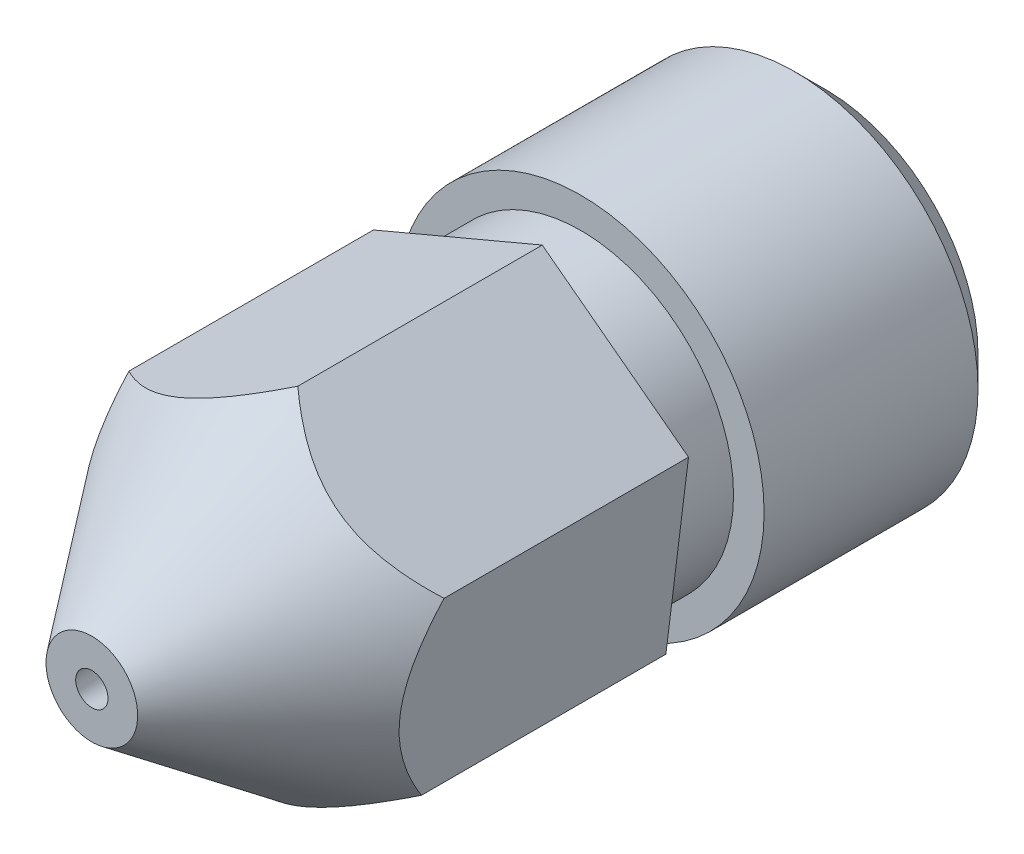
ISO-10303-21;
HEADER;
FILE_DESCRIPTION(('STEP AP214'),'2;1');
FILE_NAME('part.step','',(''),(''),'','','');
FILE_SCHEMA(('AUTOMOTIVE_DESIGN { 1 0 10303 214 1 1 1 1 }'));
ENDSEC;
DATA;
#1=APPLICATION_CONTEXT('core data for automotive mechanical design processes');
#2=APPLICATION_PROTOCOL_DEFINITION('international standard','automotive_design',2000,#1);
#3=PRODUCT_CONTEXT('',#1,'mechanical');
#4=PRODUCT('Part','Part','',(#3));
#5=PRODUCT_RELATED_PRODUCT_CATEGORY('part','',(#4));
#6=PRODUCT_DEFINITION_FORMATION('','',#4);
#7=PRODUCT_DEFINITION_CONTEXT('part definition',#1,'design');
#8=PRODUCT_DEFINITION('design','',#6,#7);
#9=PRODUCT_DEFINITION_SHAPE('','',#8);
#10=(LENGTH_UNIT() NAMED_UNIT(*) SI_UNIT(.MILLI.,.METRE.));
#11=(NAMED_UNIT(*) PLANE_ANGLE_UNIT() SI_UNIT($,.RADIAN.));
#12=(NAMED_UNIT(*) SI_UNIT($,.STERADIAN.) SOLID_ANGLE_UNIT());
#13=UNCERTAINTY_MEASURE_WITH_UNIT(LENGTH_MEASURE(1.E-05),#10,'distance_accuracy_value','');
#14=(GEOMETRIC_REPRESENTATION_CONTEXT(3) GLOBAL_UNCERTAINTY_ASSIGNED_CONTEXT((#13)) GLOBAL_UNIT_ASSIGNED_CONTEXT((#10,
#11,#12)) REPRESENTATION_CONTEXT('',''));
#15=CARTESIAN_POINT('',(0.,0.,0.));
#16=DIRECTION('',(0.,0.,1.));
#17=DIRECTION('',(1.,0.,0.));
#18=AXIS2_PLACEMENT_3D('',#15,#16,#17);
#19=CARTESIAN_POINT('',(0.,0.,-4.50000000000023));
#20=DIRECTION('',(0.,0.,1.));
#21=DIRECTION('',(1.,0.,0.));
#22=AXIS2_PLACEMENT_3D('',#19,#20,#21);
#23=CONICAL_SURFACE('',#22,2.99999999999296,0.785398163397448);
#24=CARTESIAN_POINT('',(0.,0.,-4.99999999999545));
#25=DIRECTION('',(0.,0.,1.));
#26=DIRECTION('',(1.,0.,0.));
#27=AXIS2_PLACEMENT_3D('',#24,#25,#26);
#28=CIRCLE('',#27,2.49999999999774);
#29=CARTESIAN_POINT('',(2.49999999999773,0.,-4.99999999999545));
#30=VERTEX_POINT('',#29);
#31=EDGE_CURVE('E183',#30,#30,#28,.T.);
#32=ORIENTED_EDGE('',*,*,#31,.T.);
#33=EDGE_LOOP('',(#32));
#34=FACE_BOUND('',#33,.T.);
#35=CARTESIAN_POINT('',(0.,0.,-4.50000000000023));
#36=DIRECTION('',(0.,0.,1.));
#37=DIRECTION('',(1.,0.,0.));
#38=AXIS2_PLACEMENT_3D('',#35,#36,#37);
#39=CIRCLE('',#38,2.99999999999296);
#40=CARTESIAN_POINT('',(2.99999999999295,0.,-4.50000000000023));
#41=VERTEX_POINT('',#40);
#42=EDGE_CURVE('E167',#41,#41,#39,.T.);
#43=ORIENTED_EDGE('',*,*,#42,.F.);
#44=EDGE_LOOP('',(#43));
#45=FACE_BOUND('',#44,.T.);
#46=ADVANCED_FACE('F39',(#34,#45),#23,.T.);
#47=CARTESIAN_POINT('',(2.49999999999773,0.,-4.99999999999545));
#48=DIRECTION('',(0.,0.,-1.));
#49=DIRECTION('',(-1.,0.,0.));
#50=AXIS2_PLACEMENT_3D('',#47,#48,#49);
#51=PLANE('',#50);
#52=CARTESIAN_POINT('',(0.,0.,-4.99999999999545));
#53=DIRECTION('',(0.,0.,1.));
#54=DIRECTION('',(1.,0.,0.));
#55=AXIS2_PLACEMENT_3D('',#52,#53,#54);
#56=CIRCLE('',#55,1.50000000002137);
#57=CARTESIAN_POINT('',(1.50000000002137,0.,-4.99999999999545));
#58=VERTEX_POINT('',#57);
#59=EDGE_CURVE('E163',#58,#58,#56,.T.);
#60=ORIENTED_EDGE('',*,*,#59,.T.);
#61=EDGE_LOOP('',(#60));
#62=FACE_BOUND('',#61,.T.);
#63=ORIENTED_EDGE('',*,*,#31,.F.);
#64=EDGE_LOOP('',(#63));
#65=FACE_BOUND('',#64,.T.);
#66=ADVANCED_FACE('F268',(#62,#65),#51,.T.);
#67=CARTESIAN_POINT('',(0.,0.,-4.99999999999545));
#68=DIRECTION('',(0.,0.,1.));
#69=DIRECTION('',(1.,0.,0.));
#70=AXIS2_PLACEMENT_3D('',#67,#68,#69);
#71=CYLINDRICAL_SURFACE('',#70,2.5);
#72=CARTESIAN_POINT('',(0.,0.,-1.));
#73=DIRECTION('',(0.,0.,1.));
#74=DIRECTION('',(1.,0.,0.));
#75=AXIS2_PLACEMENT_3D('',#72,#73,#74);
#76=CIRCLE('',#75,2.5);
#77=CARTESIAN_POINT('',(2.49999999999999,0.,-1.));
#78=VERTEX_POINT('',#77);
#79=EDGE_CURVE('E175',#78,#78,#76,.T.);
#80=ORIENTED_EDGE('',*,*,#79,.T.);
#81=EDGE_LOOP('',(#80));
#82=FACE_BOUND('',#81,.T.);
#83=CARTESIAN_POINT('',(0.,0.,0.));
#84=DIRECTION('',(0.,0.,1.));
#85=DIRECTION('',(1.,0.,0.));
#86=AXIS2_PLACEMENT_3D('',#83,#84,#85);
#87=CIRCLE('',#86,2.5);
#88=CARTESIAN_POINT('',(2.49999999999999,0.,0.));
#89=VERTEX_POINT('',#88);
#90=EDGE_CURVE('E179',#89,#89,#87,.T.);
#91=ORIENTED_EDGE('',*,*,#90,.F.);
#92=EDGE_LOOP('',(#91));
#93=FACE_BOUND('',#92,.T.);
#94=ADVANCED_FACE('F273',(#82,#93),#71,.T.);
#95=CARTESIAN_POINT('',(2.49999999999999,0.,-1.));
#96=DIRECTION('',(0.,0.,1.));
#97=DIRECTION('',(1.,0.,0.));
#98=AXIS2_PLACEMENT_3D('',#95,#96,#97);
#99=PLANE('',#98);
#100=CARTESIAN_POINT('',(0.,0.,-1.));
#101=DIRECTION('',(0.,0.,1.));
#102=DIRECTION('',(1.,0.,0.));
#103=AXIS2_PLACEMENT_3D('',#100,#101,#102);
#104=CIRCLE('',#103,2.99999999999296);
#105=CARTESIAN_POINT('',(2.99999999999295,0.,-1.));
#106=VERTEX_POINT('',#105);
#107=EDGE_CURVE('E171',#106,#106,#104,.T.);
#108=ORIENTED_EDGE('',*,*,#107,.T.);
#109=EDGE_LOOP('',(#108));
#110=FACE_BOUND('',#109,.T.);
#111=ORIENTED_EDGE('',*,*,#79,.F.);
#112=EDGE_LOOP('',(#111));
#113=FACE_BOUND('',#112,.T.);
#114=ADVANCED_FACE('F282',(#110,#113),#99,.T.);
#115=CARTESIAN_POINT('',(0.,0.,-4.99999999999545));
#116=DIRECTION('',(0.,0.,1.));
#117=DIRECTION('',(1.,0.,0.));
#118=AXIS2_PLACEMENT_3D('',#115,#116,#117);
#119=CYLINDRICAL_SURFACE('',#118,2.99999999999296);
#120=ORIENTED_EDGE('',*,*,#42,.T.);
#121=EDGE_LOOP('',(#120));
#122=FACE_BOUND('',#121,.T.);
#123=ORIENTED_EDGE('',*,*,#107,.F.);
#124=EDGE_LOOP('',(#123));
#125=FACE_BOUND('',#124,.T.);
#126=ADVANCED_FACE('F279',(#122,#125),#119,.T.);
#127=CARTESIAN_POINT('',(0.,0.,-4.49999999998704));
#128=DIRECTION('',(0.,0.,-1.));
#129=DIRECTION('',(-1.,0.,0.));
#130=AXIS2_PLACEMENT_3D('',#127,#128,#129);
#131=CONICAL_SURFACE('',#130,1.00000000001296,0.785398163397447);
#132=ORIENTED_EDGE('',*,*,#59,.F.);
#133=EDGE_LOOP('',(#132));
#134=FACE_BOUND('',#133,.T.);
#135=CARTESIAN_POINT('',(0.,0.,-4.49999999998704));
#136=DIRECTION('',(0.,0.,1.));
#137=DIRECTION('',(1.,0.,0.));
#138=AXIS2_PLACEMENT_3D('',#135,#136,#137);
#139=CIRCLE('',#138,1.00000000001296);
#140=CARTESIAN_POINT('',(1.00000000001296,0.,-4.49999999998704));
#141=VERTEX_POINT('',#140);
#142=EDGE_CURVE('E159',#141,#141,#139,.T.);
#143=ORIENTED_EDGE('',*,*,#142,.T.);
#144=EDGE_LOOP('',(#143));
#145=FACE_BOUND('',#144,.T.);
#146=ADVANCED_FACE('F265',(#134,#145),#131,.F.);
#147=CARTESIAN_POINT('',(0.,0.,-4.99999999999545));
#148=DIRECTION('',(0.,0.,1.));
#149=DIRECTION('',(1.,0.,0.));
#150=AXIS2_PLACEMENT_3D('',#147,#148,#149);
#151=CYLINDRICAL_SURFACE('',#150,1.00000000001296);
#152=CARTESIAN_POINT('',(0.,0.,0.));
#153=DIRECTION('',(0.,0.,1.));
#154=DIRECTION('',(1.,0.,0.));
#155=AXIS2_PLACEMENT_3D('',#152,#153,#154);
#156=CIRCLE('',#155,1.00000000001296);
#157=CARTESIAN_POINT('',(1.00000000001296,0.,0.));
#158=VERTEX_POINT('',#157);
#159=EDGE_CURVE('E109',#158,#158,#156,.T.);
#160=ORIENTED_EDGE('',*,*,#159,.T.);
#161=EDGE_LOOP('',(#160));
#162=FACE_BOUND('',#161,.T.);
#163=ORIENTED_EDGE('',*,*,#142,.F.);
#164=EDGE_LOOP('',(#163));
#165=FACE_BOUND('',#164,.T.);
#166=ADVANCED_FACE('F258',(#162,#165),#151,.F.);
#167=CARTESIAN_POINT('',(0.,0.,0.));
#168=DIRECTION('',(0.,0.,-1.));
#169=DIRECTION('',(-1.,0.,0.));
#170=AXIS2_PLACEMENT_3D('',#167,#168,#169);
#171=PLANE('',#170);
#172=DIRECTION('',(0.123460923134291,0.99234943465436,0.));
#173=VECTOR('',#172,1.);
#174=CARTESIAN_POINT('',(2.39300807481834,-1.80928503940421,0.));
#175=LINE('',#174,#173);
#176=CARTESIAN_POINT('',(2.39300807481834,-1.80928503940421,0.));
#177=VERTEX_POINT('',#176);
#178=CARTESIAN_POINT('',(2.76339084422034,1.16776326455187,0.));
#179=VERTEX_POINT('',#178);
#180=EDGE_CURVE('E113',#177,#179,#175,.T.);
#181=ORIENTED_EDGE('',*,*,#180,.F.);
#182=DIRECTION('',(0.921130281408947,0.389254421518206,0.));
#183=VECTOR('',#182,1.);
#184=CARTESIAN_POINT('',(-0.370382769402001,-2.97704830395608,0.));
#185=LINE('',#184,#183);
#186=CARTESIAN_POINT('',(-0.370382769402004,-2.97704830395608,0.));
#187=VERTEX_POINT('',#186);
#188=EDGE_CURVE('E135',#187,#177,#185,.T.);
#189=ORIENTED_EDGE('',*,*,#188,.F.);
#190=DIRECTION('',(0.797669358274657,-0.603095013136154,0.));
#191=VECTOR('',#190,1.);
#192=CARTESIAN_POINT('',(-2.76339084422034,-1.16776326455187,0.));
#193=LINE('',#192,#191);
#194=CARTESIAN_POINT('',(-2.76339084422034,-1.16776326455187,0.));
#195=VERTEX_POINT('',#194);
#196=EDGE_CURVE('E60',#195,#187,#193,.T.);
#197=ORIENTED_EDGE('',*,*,#196,.F.);
#198=DIRECTION('',(-0.123460923134291,-0.992349434654361,0.));
#199=VECTOR('',#198,1.);
#200=CARTESIAN_POINT('',(-2.39300807481834,1.80928503940421,0.));
#201=LINE('',#200,#199);
#202=CARTESIAN_POINT('',(-2.39300807481834,1.80928503940421,0.));
#203=VERTEX_POINT('',#202);
#204=EDGE_CURVE('E127',#203,#195,#201,.T.);
#205=ORIENTED_EDGE('',*,*,#204,.F.);
#206=DIRECTION('',(-0.921130281408947,-0.389254421518206,0.));
#207=VECTOR('',#206,1.);
#208=CARTESIAN_POINT('',(0.370382769402002,2.97704830395608,0.));
#209=LINE('',#208,#207);
#210=CARTESIAN_POINT('',(0.370382769402002,2.97704830395608,0.));
#211=VERTEX_POINT('',#210);
#212=EDGE_CURVE('E123',#211,#203,#209,.T.);
#213=ORIENTED_EDGE('',*,*,#212,.F.);
#214=DIRECTION('',(-0.797669358274656,0.603095013136154,0.));
#215=VECTOR('',#214,1.);
#216=CARTESIAN_POINT('',(2.76339084422034,1.16776326455187,0.));
#217=LINE('',#216,#215);
#218=EDGE_CURVE('E104',#179,#211,#217,.T.);
#219=ORIENTED_EDGE('',*,*,#218,.F.);
#220=EDGE_LOOP('',(#181,#189,#197,#205,#213,#219));
#221=FACE_BOUND('',#220,.T.);
#222=ORIENTED_EDGE('',*,*,#90,.T.);
#223=EDGE_LOOP('',(#222));
#224=FACE_BOUND('',#223,.T.);
#225=ADVANCED_FACE('F119',(#221,#224),#171,.T.);
#226=CARTESIAN_POINT('',(0.,0.,8.));
#227=DIRECTION('',(0.,0.,-1.));
#228=DIRECTION('',(-1.,0.,0.));
#229=AXIS2_PLACEMENT_3D('',#226,#227,#228);
#230=CONICAL_SURFACE('',#229,0.,0.643501108792156);
#231=CARTESIAN_POINT('',(0.,0.,7.));
#232=DIRECTION('',(0.,0.,-1.));
#233=DIRECTION('',(-1.,0.,0.));
#234=AXIS2_PLACEMENT_3D('',#231,#232,#233);
#235=CIRCLE('',#234,0.749999999998237);
#236=CARTESIAN_POINT('',(-0.749999999998236,0.,7.));
#237=VERTEX_POINT('',#236);
#238=EDGE_CURVE('E158',#237,#237,#235,.T.);
#239=ORIENTED_EDGE('',*,*,#238,.T.);
#240=EDGE_LOOP('',(#239));
#241=FACE_BOUND('',#240,.T.);
#242=CARTESIAN_POINT('',(-0.370582769402001,-2.9771328206481,3.99985524244155));
#243=CARTESIAN_POINT('',(-0.333361920773163,-2.96140390564677,4.02679221943423));
#244=CARTESIAN_POINT('',(-0.295793541917818,-2.94552813011983,4.05317321176297));
#245=CARTESIAN_POINT('',(-0.219932807668971,-2.91347063855543,4.10462298886514));
#246=CARTESIAN_POINT('',(-0.181640877185633,-2.89728910207797,4.1296925130885));
#247=CARTESIAN_POINT('',(-0.104006471428016,-2.86448208627032,4.17851080751373));
#248=CARTESIAN_POINT('',(-0.064658730825574,-2.84785438189953,4.2022497695316));
#249=CARTESIAN_POINT('',(0.0149159389363024,-2.81422744261545,4.24801646835328));
#250=CARTESIAN_POINT('',(0.0551436438455453,-2.79722787988313,4.27004261030164));
#251=CARTESIAN_POINT('',(0.178035775469737,-2.74529569768265,4.33360293794611));
#252=CARTESIAN_POINT('',(0.262078530884565,-2.70978061930334,4.37208454741731));
#253=CARTESIAN_POINT('',(0.433623631067221,-2.63728849730541,4.43839845315821));
#254=CARTESIAN_POINT('',(0.521120752794357,-2.6003136608574,4.46624619518939));
#255=CARTESIAN_POINT('',(0.662678510240097,-2.54049369391236,4.50014531979392));
#256=CARTESIAN_POINT('',(0.71588337198582,-2.51801019934186,4.51045553230541));
#257=CARTESIAN_POINT('',(0.82293558616725,-2.47277170426199,4.52603733132246));
#258=CARTESIAN_POINT('',(0.876783028073414,-2.45001666594389,4.53130820768266));
#259=CARTESIAN_POINT('',(0.984269806538549,-2.40459453118538,4.53654224280696));
#260=CARTESIAN_POINT('',(1.03790738375276,-2.38192817821496,4.53654734923023));
#261=CARTESIAN_POINT('',(1.14495601601545,-2.33669119679471,4.53136796460535));
#262=CARTESIAN_POINT('',(1.1983670787631,-2.31412056509134,4.52618365138728));
#263=CARTESIAN_POINT('',(1.35720846685355,-2.24699682170541,4.50319933837946));
#264=CARTESIAN_POINT('',(1.46177394947424,-2.20280917825281,4.47799026676357));
#265=CARTESIAN_POINT('',(1.66695882120838,-2.11610144519578,4.41120973182767));
#266=CARTESIAN_POINT('',(1.76754392865753,-2.07359584245566,4.3695204503603));
#267=CARTESIAN_POINT('',(1.95840191705215,-1.99294241333265,4.27664427152543));
#268=CARTESIAN_POINT('',(2.04893869757002,-1.95468306735533,4.22608171985809));
#269=CARTESIAN_POINT('',(2.18098909567025,-1.89888075321891,4.14469972163282));
#270=CARTESIAN_POINT('',(2.22410122228619,-1.88066228158139,4.11685566698191));
#271=CARTESIAN_POINT('',(2.30935459191982,-1.84463561765665,4.05952584104556));
#272=CARTESIAN_POINT('',(2.35149640937574,-1.82682718262134,4.03004107835905));
#273=CARTESIAN_POINT('',(2.39320807481834,-1.80920052271219,3.99985524244155));
#274=B_SPLINE_CURVE_WITH_KNOTS('',3,(#242,#243,#244,#245,#246,#247,#248,#249,#250,#251,#252,
#253,#254,#255,#256,#257,#258,#259,#260,#261,#262,#263,#264,#265,#266,#267,#268,#269,#270,#271,
#272,#273),.UNSPECIFIED.,.F.,.F.,(4,2,2,2,2,2,2,2,2,2,2,2,2,2,2,4),(0.,0.145693025165176,
0.291302998167504,0.43787392461132,0.584579732690164,0.881125926877011,1.17723973235047,
1.35306592789389,1.52891689728815,1.70336700905731,1.87781114300715,2.22500602088697,
2.57472925837995,2.9058200715097,3.06917296361676,3.23242652329506),.UNSPECIFIED.);
#275=CARTESIAN_POINT('',(-0.370382769402001,-2.97704830395608,4.));
#276=VERTEX_POINT('',#275);
#277=CARTESIAN_POINT('',(2.39300807481835,-1.8092850394042,4.));
#278=VERTEX_POINT('',#277);
#279=EDGE_CURVE('E187',#276,#278,#274,.T.);
#280=ORIENTED_EDGE('',*,*,#279,.T.);
#281=CARTESIAN_POINT('',(2.39298319226814,-1.80948503940421,3.99986563195734));
#282=CARTESIAN_POINT('',(2.39797192228569,-1.76938681814616,4.0268021058926));
#283=CARTESIAN_POINT('',(2.4030072316939,-1.72891420286275,4.05318260000207));
#284=CARTESIAN_POINT('',(2.41317488477654,-1.64718903402254,4.10463139540376));
#285=CARTESIAN_POINT('',(2.41830717150243,-1.60593693820446,4.12970043611267));
#286=CARTESIAN_POINT('',(2.42871254787059,-1.5223010063309,4.17851777332693));
#287=CARTESIAN_POINT('',(2.43398634319775,-1.47991149814862,4.20225626208727));
#288=CARTESIAN_POINT('',(2.44465177042376,-1.39418533954404,4.24802203883542));
#289=CARTESIAN_POINT('',(2.45004350629254,-1.35084785343625,4.27004773203637));
#290=CARTESIAN_POINT('',(2.46651478295772,-1.21845566267845,4.33360673818322));
#291=CARTESIAN_POINT('',(2.47777905903127,-1.12791609996015,4.37208752832603));
#292=CARTESIAN_POINT('',(2.50077129275697,-0.943110012658147,4.43840003092347));
#293=CARTESIAN_POINT('',(2.51249855040215,-0.848849114563483,4.46624718823034));
#294=CARTESIAN_POINT('',(2.53147165119599,-0.69634785855129,4.50014581538181));
#295=CARTESIAN_POINT('',(2.53860279847443,-0.639029398664991,4.51045594493281));
#296=CARTESIAN_POINT('',(2.55295120638524,-0.523700320305522,4.52603758394495));
#297=CARTESIAN_POINT('',(2.56016847900888,-0.465689605449444,4.53130838329195));
#298=CARTESIAN_POINT('',(2.57457513189871,-0.349892367849549,4.53654227538365));
#299=CARTESIAN_POINT('',(2.58176427636791,-0.292107740385642,4.53654731484393));
#300=CARTESIAN_POINT('',(2.59611220345845,-0.17678252674483,4.53136780733093));
#301=CARTESIAN_POINT('',(2.60327098711168,-0.119241932273704,4.52618343817866));
#302=CARTESIAN_POINT('',(2.6245607913658,0.05188043324189,4.50319897810853));
#303=CARTESIAN_POINT('',(2.63857589473794,0.164530489266799,4.47798983549132));
#304=CARTESIAN_POINT('',(2.66607719667653,0.385579390718213,4.41120921597008));
#305=CARTESIAN_POINT('',(2.6795588005271,0.493941304915133,4.36951992434762));
#306=CARTESIAN_POINT('',(2.70513947518682,0.69955266268084,4.27664509848014));
#307=CARTESIAN_POINT('',(2.71727393494992,0.797086554215518,4.22608422605656));
#308=CARTESIAN_POINT('',(2.73497239514727,0.939342553322076,4.1447050278909));
#309=CARTESIAN_POINT('',(2.74075063421682,0.985786659913881,4.1168619384444));
#310=CARTESIAN_POINT('',(2.7521769902271,1.07762898248122,4.05953411890449));
#311=CARTESIAN_POINT('',(2.75782518414813,1.12302781720608,4.0300503972492));
#312=CARTESIAN_POINT('',(2.76341572677055,1.16796326455187,3.99986563195734));
#313=B_SPLINE_CURVE_WITH_KNOTS('',3,(#281,#282,#283,#284,#285,#286,#287,#288,#289,#290,#291,
#292,#293,#294,#295,#296,#297,#298,#299,#300,#301,#302,#303,#304,#305,#306,#307,#308,#309,#310,
#311,#312),.UNSPECIFIED.,.F.,.F.,(4,2,2,2,2,2,2,2,2,2,2,2,2,2,2,4),(0.,0.145691089404386,
0.291299130593188,0.437868081342506,0.584571908090664,0.881113991618833,1.17722370840094,
1.3530497134868,1.52890049133734,1.70335044206921,1.87779441527906,2.22498896391071,
2.57471180448658,2.90579247599771,3.06914044350928,3.23238909272478),.UNSPECIFIED.);
#314=CARTESIAN_POINT('',(2.76339084422034,1.16776326455187,4.));
#315=VERTEX_POINT('',#314);
#316=EDGE_CURVE('E12',#278,#315,#313,.T.);
#317=ORIENTED_EDGE('',*,*,#316,.T.);
#318=CARTESIAN_POINT('',(2.76359084422034,1.16761205026568,3.9998328358871));
#319=CARTESIAN_POINT('',(2.73135802287283,1.19198236562547,4.02677089781496));
#320=CARTESIAN_POINT('',(2.69882424064471,1.21658022890892,4.05315296464437));
#321=CARTESIAN_POINT('',(2.63312971129852,1.26624998571732,4.10460485896189));
#322=CARTESIAN_POINT('',(2.59996933218114,1.29132160100746,4.12967542597169));
#323=CARTESIAN_POINT('',(2.53273878433325,1.34215269752241,4.17849578479594));
#324=CARTESIAN_POINT('',(2.49866405547437,1.36791562652999,4.20223576747961));
#325=CARTESIAN_POINT('',(2.42975320931284,1.42001714859536,4.24800445491925));
#326=CARTESIAN_POINT('',(2.39491642016097,1.44635624961913,4.2700315646718));
#327=CARTESIAN_POINT('',(2.28849297723285,1.52681997440049,4.33359474236047));
#328=CARTESIAN_POINT('',(2.21571266718473,1.5818470875636,4.37207811885524));
#329=CARTESIAN_POINT('',(2.0671559574409,1.69416657167692,4.43839505070079));
#330=CARTESIAN_POINT('',(1.99138408139398,1.75145552242553,4.46624405377415));
#331=CARTESIAN_POINT('',(1.86879726600073,1.84413991135558,4.50014425116406));
#332=CARTESIAN_POINT('',(1.82272347223468,1.8789749905376,4.5104546425654));
#333=CARTESIAN_POINT('',(1.73001949507152,1.94906581920616,4.52603678660069));
#334=CARTESIAN_POINT('',(1.68338923418692,1.98432162727877,4.53130782902195));
#335=CARTESIAN_POINT('',(1.59030893079006,2.05469698546136,4.53654217255738));
#336=CARTESIAN_POINT('',(1.54386041197414,2.08981538354805,4.53654742336562));
#337=CARTESIAN_POINT('',(1.45115952649325,2.15990387468397,4.5313683037058));
#338=CARTESIAN_POINT('',(1.40490715316066,2.1948739727744,4.52618411108735));
#339=CARTESIAN_POINT('',(1.26735527414931,2.29887301876845,4.50320011515134));
#340=CARTESIAN_POINT('',(1.17680468570075,2.36733573175017,4.47799119660345));
#341=CARTESIAN_POINT('',(0.999120671037324,2.50167753897379,4.41121084398575));
#342=CARTESIAN_POINT('',(0.912016933371524,2.56753418655192,4.36952158437386));
#343=CARTESIAN_POINT('',(0.746734433138288,2.69249956301435,4.27664248769128));
#344=CARTESIAN_POINT('',(0.668327392372469,2.75178088652277,4.22607631454379));
#345=CARTESIAN_POINT('',(0.553968765064754,2.83824417751286,4.14468827767456));
#346=CARTESIAN_POINT('',(0.516632743748496,2.86647287657544,4.11684214145396));
#347=CARTESIAN_POINT('',(0.442801557394463,2.92229452729091,4.05950798850506));
#348=CARTESIAN_POINT('',(0.406305894733334,2.9498878551826,4.03002098072255));
#349=CARTESIAN_POINT('',(0.370182769402002,2.97719951824227,3.9998328358871));
#350=B_SPLINE_CURVE_WITH_KNOTS('',3,(#318,#319,#320,#321,#322,#323,#324,#325,#326,#327,#328,
#329,#330,#331,#332,#333,#334,#335,#336,#337,#338,#339,#340,#341,#342,#343,#344,#345,#346,#347,
#348,#349),.UNSPECIFIED.,.F.,.F.,(4,2,2,2,2,2,2,2,2,2,2,2,2,2,2,4),(0.,0.145697200001847,
0.291311339327328,0.43788652673678,0.584596607937403,0.881151667549265,1.17727429106834,
1.35310089737553,1.5289522798762,1.70340273896161,1.87784721958652,2.22504280756198,
2.57476690108368,2.90587958542842,3.06924309780157,3.23250724726373),.UNSPECIFIED.);
#351=CARTESIAN_POINT('',(0.370382769402002,2.97704830395608,4.));
#352=VERTEX_POINT('',#351);
#353=EDGE_CURVE('E53',#315,#352,#350,.T.);
#354=ORIENTED_EDGE('',*,*,#353,.T.);
#355=CARTESIAN_POINT('',(0.370582769402002,2.9771328206481,3.99985524244155));
#356=CARTESIAN_POINT('',(0.333361920773164,2.96140390564677,4.02679221943423));
#357=CARTESIAN_POINT('',(0.295793541917819,2.94552813011983,4.05317321176297));
#358=CARTESIAN_POINT('',(0.219932807668972,2.91347063855543,4.10462298886514));
#359=CARTESIAN_POINT('',(0.181640877185634,2.89728910207797,4.1296925130885));
#360=CARTESIAN_POINT('',(0.104006471428017,2.86448208627032,4.17851080751374));
#361=CARTESIAN_POINT('',(0.0646587308255749,2.84785438189953,4.2022497695316));
#362=CARTESIAN_POINT('',(-0.0149159389363014,2.81422744261545,4.24801646835328));
#363=CARTESIAN_POINT('',(-0.0551436438455442,2.79722787988313,4.27004261030164));
#364=CARTESIAN_POINT('',(-0.178035775469735,2.74529569768265,4.33360293794611));
#365=CARTESIAN_POINT('',(-0.262078530884563,2.70978061930334,4.37208454741731));
#366=CARTESIAN_POINT('',(-0.433623631067219,2.63728849730541,4.43839845315821));
#367=CARTESIAN_POINT('',(-0.521120752794356,2.6003136608574,4.46624619518939));
#368=CARTESIAN_POINT('',(-0.662678510240095,2.54049369391236,4.50014531979392));
#369=CARTESIAN_POINT('',(-0.715883371985818,2.51801019934186,4.51045553230541));
#370=CARTESIAN_POINT('',(-0.822935586167248,2.47277170426199,4.52603733132246));
#371=CARTESIAN_POINT('',(-0.876783028073412,2.45001666594389,4.53130820768266));
#372=CARTESIAN_POINT('',(-0.984269806538547,2.40459453118538,4.53654224280696));
#373=CARTESIAN_POINT('',(-1.03790738375276,2.38192817821496,4.53654734923023));
#374=CARTESIAN_POINT('',(-1.14495601601545,2.33669119679471,4.53136796460535));
#375=CARTESIAN_POINT('',(-1.19836707876309,2.31412056509134,4.52618365138728));
#376=CARTESIAN_POINT('',(-1.35720846685355,2.24699682170541,4.50319933837946));
#377=CARTESIAN_POINT('',(-1.46177394947424,2.20280917825282,4.47799026676357));
#378=CARTESIAN_POINT('',(-1.66695882120838,2.11610144519578,4.41120973182767));
#379=CARTESIAN_POINT('',(-1.76754392865753,2.07359584245566,4.3695204503603));
#380=CARTESIAN_POINT('',(-1.95840191705214,1.99294241333265,4.27664427152543));
#381=CARTESIAN_POINT('',(-2.04893869757002,1.95468306735533,4.22608171985809));
#382=CARTESIAN_POINT('',(-2.18098909567025,1.89888075321891,4.14469972163282));
#383=CARTESIAN_POINT('',(-2.22410122228618,1.88066228158139,4.11685566698191));
#384=CARTESIAN_POINT('',(-2.30935459191982,1.84463561765665,4.05952584104556));
#385=CARTESIAN_POINT('',(-2.35149640937574,1.82682718262135,4.03004107835905));
#386=CARTESIAN_POINT('',(-2.39320807481834,1.80920052271219,3.99985524244155));
#387=B_SPLINE_CURVE_WITH_KNOTS('',3,(#355,#356,#357,#358,#359,#360,#361,#362,#363,#364,#365,
#366,#367,#368,#369,#370,#371,#372,#373,#374,#375,#376,#377,#378,#379,#380,#381,#382,#383,#384,
#385,#386),.UNSPECIFIED.,.F.,.F.,(4,2,2,2,2,2,2,2,2,2,2,2,2,2,2,4),(0.,0.145693025165176,
0.291302998167504,0.43787392461132,0.584579732690164,0.88112592687701,1.17723973235046,
1.35306592789389,1.52891689728815,1.7033670090573,1.87781114300715,2.22500602088696,
2.57472925837995,2.9058200715097,3.06917296361676,3.23242652329506),.UNSPECIFIED.);
#388=CARTESIAN_POINT('',(-2.39300807481834,1.80928503940421,4.));
#389=VERTEX_POINT('',#388);
#390=EDGE_CURVE('E233',#352,#389,#387,.T.);
#391=ORIENTED_EDGE('',*,*,#390,.T.);
#392=CARTESIAN_POINT('',(-2.39298319226814,1.80948503940421,3.99986563195734));
#393=CARTESIAN_POINT('',(-2.39797192228569,1.76938681814616,4.0268021058926));
#394=CARTESIAN_POINT('',(-2.4030072316939,1.72891420286275,4.05318260000207));
#395=CARTESIAN_POINT('',(-2.41317488477654,1.64718903402254,4.10463139540376));
#396=CARTESIAN_POINT('',(-2.41830717150243,1.60593693820446,4.12970043611267));
#397=CARTESIAN_POINT('',(-2.42871254787059,1.5223010063309,4.17851777332693));
#398=CARTESIAN_POINT('',(-2.43398634319775,1.47991149814862,4.20225626208726));
#399=CARTESIAN_POINT('',(-2.44465177042376,1.39418533954404,4.24802203883542));
#400=CARTESIAN_POINT('',(-2.45004350629254,1.35084785343625,4.27004773203637));
#401=CARTESIAN_POINT('',(-2.46651478295772,1.21845566267845,4.33360673818322));
#402=CARTESIAN_POINT('',(-2.47777905903127,1.12791609996015,4.37208752832603));
#403=CARTESIAN_POINT('',(-2.50077129275697,0.943110012658147,4.43840003092347));
#404=CARTESIAN_POINT('',(-2.51249855040215,0.848849114563484,4.46624718823034));
#405=CARTESIAN_POINT('',(-2.53147165119599,0.696347858551291,4.50014581538181));
#406=CARTESIAN_POINT('',(-2.53860279847443,0.639029398664992,4.51045594493281));
#407=CARTESIAN_POINT('',(-2.55295120638524,0.523700320305524,4.52603758394495));
#408=CARTESIAN_POINT('',(-2.56016847900888,0.465689605449445,4.53130838329195));
#409=CARTESIAN_POINT('',(-2.57457513189871,0.34989236784955,4.53654227538365));
#410=CARTESIAN_POINT('',(-2.58176427636791,0.292107740385643,4.53654731484393));
#411=CARTESIAN_POINT('',(-2.59611220345845,0.176782526744832,4.53136780733093));
#412=CARTESIAN_POINT('',(-2.60327098711168,0.119241932273705,4.52618343817866));
#413=CARTESIAN_POINT('',(-2.6245607913658,-0.0518804332418892,4.50319897810853));
#414=CARTESIAN_POINT('',(-2.63857589473794,-0.164530489266798,4.47798983549132));
#415=CARTESIAN_POINT('',(-2.66607719667653,-0.385579390718212,4.41120921597008));
#416=CARTESIAN_POINT('',(-2.6795588005271,-0.493941304915132,4.36951992434762));
#417=CARTESIAN_POINT('',(-2.70513947518682,-0.69955266268084,4.27664509848014));
#418=CARTESIAN_POINT('',(-2.71727393494992,-0.797086554215519,4.22608422605657));
#419=CARTESIAN_POINT('',(-2.73497239514727,-0.939342553322077,4.1447050278909));
#420=CARTESIAN_POINT('',(-2.74075063421682,-0.985786659913881,4.1168619384444));
#421=CARTESIAN_POINT('',(-2.7521769902271,-1.07762898248122,4.05953411890449));
#422=CARTESIAN_POINT('',(-2.75782518414813,-1.12302781720608,4.0300503972492));
#423=CARTESIAN_POINT('',(-2.76341572677055,-1.16796326455187,3.99986563195734));
#424=B_SPLINE_CURVE_WITH_KNOTS('',3,(#392,#393,#394,#395,#396,#397,#398,#399,#400,#401,#402,
#403,#404,#405,#406,#407,#408,#409,#410,#411,#412,#413,#414,#415,#416,#417,#418,#419,#420,#421,
#422,#423),.UNSPECIFIED.,.F.,.F.,(4,2,2,2,2,2,2,2,2,2,2,2,2,2,2,4),(0.,0.145691089404386,
0.291299130593189,0.437868081342506,0.584571908090665,0.881113991618834,1.17722370840094,
1.3530497134868,1.52890049133734,1.70335044206921,1.87779441527906,2.22498896391071,
2.57471180448658,2.90579247599771,3.06914044350928,3.23238909272478),.UNSPECIFIED.);
#425=CARTESIAN_POINT('',(-2.76339084422034,-1.16776326455187,4.));
#426=VERTEX_POINT('',#425);
#427=EDGE_CURVE('E225',#389,#426,#424,.T.);
#428=ORIENTED_EDGE('',*,*,#427,.T.);
#429=CARTESIAN_POINT('',(-2.76359084422034,-1.16761205026568,3.9998328358871));
#430=CARTESIAN_POINT('',(-2.73135802287283,-1.19198236562547,4.02677089781496));
#431=CARTESIAN_POINT('',(-2.69882424064471,-1.21658022890892,4.05315296464437));
#432=CARTESIAN_POINT('',(-2.63312971129852,-1.26624998571732,4.10460485896189));
#433=CARTESIAN_POINT('',(-2.59996933218114,-1.29132160100746,4.12967542597169));
#434=CARTESIAN_POINT('',(-2.53273878433325,-1.34215269752241,4.17849578479594));
#435=CARTESIAN_POINT('',(-2.49866405547437,-1.36791562652999,4.2022357674796));
#436=CARTESIAN_POINT('',(-2.42975320931284,-1.42001714859536,4.24800445491925));
#437=CARTESIAN_POINT('',(-2.39491642016098,-1.44635624961913,4.2700315646718));
#438=CARTESIAN_POINT('',(-2.28849297723285,-1.52681997440049,4.33359474236047));
#439=CARTESIAN_POINT('',(-2.21571266718473,-1.5818470875636,4.37207811885524));
#440=CARTESIAN_POINT('',(-2.0671559574409,-1.69416657167692,4.43839505070079));
#441=CARTESIAN_POINT('',(-1.99138408139398,-1.75145552242553,4.46624405377415));
#442=CARTESIAN_POINT('',(-1.86879726600073,-1.84413991135558,4.50014425116406));
#443=CARTESIAN_POINT('',(-1.82272347223469,-1.8789749905376,4.5104546425654));
#444=CARTESIAN_POINT('',(-1.73001949507152,-1.94906581920616,4.52603678660069));
#445=CARTESIAN_POINT('',(-1.68338923418692,-1.98432162727877,4.53130782902195));
#446=CARTESIAN_POINT('',(-1.59030893079006,-2.05469698546136,4.53654217255738));
#447=CARTESIAN_POINT('',(-1.54386041197414,-2.08981538354805,4.53654742336562));
#448=CARTESIAN_POINT('',(-1.45115952649325,-2.15990387468397,4.5313683037058));
#449=CARTESIAN_POINT('',(-1.40490715316066,-2.1948739727744,4.52618411108735));
#450=CARTESIAN_POINT('',(-1.26735527414931,-2.29887301876845,4.50320011515134));
#451=CARTESIAN_POINT('',(-1.17680468570075,-2.36733573175017,4.47799119660345));
#452=CARTESIAN_POINT('',(-0.999120671037323,-2.50167753897379,4.41121084398574));
#453=CARTESIAN_POINT('',(-0.912016933371524,-2.56753418655192,4.36952158437386));
#454=CARTESIAN_POINT('',(-0.746734433138287,-2.69249956301435,4.27664248769128));
#455=CARTESIAN_POINT('',(-0.668327392372468,-2.75178088652277,4.22607631454379));
#456=CARTESIAN_POINT('',(-0.553968765064754,-2.83824417751285,4.14468827767456));
#457=CARTESIAN_POINT('',(-0.516632743748496,-2.86647287657544,4.11684214145396));
#458=CARTESIAN_POINT('',(-0.442801557394464,-2.92229452729091,4.05950798850506));
#459=CARTESIAN_POINT('',(-0.406305894733335,-2.9498878551826,4.03002098072255));
#460=CARTESIAN_POINT('',(-0.370182769402002,-2.97719951824227,3.9998328358871));
#461=B_SPLINE_CURVE_WITH_KNOTS('',3,(#429,#430,#431,#432,#433,#434,#435,#436,#437,#438,#439,
#440,#441,#442,#443,#444,#445,#446,#447,#448,#449,#450,#451,#452,#453,#454,#455,#456,#457,#458,
#459,#460),.UNSPECIFIED.,.F.,.F.,(4,2,2,2,2,2,2,2,2,2,2,2,2,2,2,4),(0.,0.145697200001847,
0.291311339327327,0.43788652673678,0.584596607937403,0.881151667549266,1.17727429106834,
1.35310089737553,1.5289522798762,1.70340273896161,1.87784721958652,2.22504280756198,
2.57476690108368,2.90587958542842,3.06924309780157,3.23250724726373),.UNSPECIFIED.);
#462=EDGE_CURVE('E199',#426,#276,#461,.T.);
#463=ORIENTED_EDGE('',*,*,#462,.T.);
#464=EDGE_LOOP('',(#280,#317,#354,#391,#428,#463));
#465=FACE_BOUND('',#464,.T.);
#466=ADVANCED_FACE('F206',(#241,#465),#230,.T.);
#467=CARTESIAN_POINT('',(0.,0.,7.));
#468=DIRECTION('',(0.,0.,-1.));
#469=DIRECTION('',(-1.,0.,0.));
#470=AXIS2_PLACEMENT_3D('',#467,#468,#469);
#471=PLANE('',#470);
#472=CARTESIAN_POINT('',(0.,0.,7.));
#473=DIRECTION('',(0.,0.,1.));
#474=DIRECTION('',(1.,0.,0.));
#475=AXIS2_PLACEMENT_3D('',#472,#473,#474);
#476=CIRCLE('',#475,0.264270353153221);
#477=CARTESIAN_POINT('',(0.264270353153221,0.,7.));
#478=VERTEX_POINT('',#477);
#479=EDGE_CURVE('E154',#478,#478,#476,.T.);
#480=ORIENTED_EDGE('',*,*,#479,.F.);
#481=EDGE_LOOP('',(#480));
#482=FACE_BOUND('',#481,.T.);
#483=ORIENTED_EDGE('',*,*,#238,.F.);
#484=EDGE_LOOP('',(#483));
#485=FACE_BOUND('',#484,.T.);
#486=ADVANCED_FACE('F253',(#482,#485),#471,.F.);
#487=CARTESIAN_POINT('',(0.,0.,0.));
#488=DIRECTION('',(0.,0.,-1.));
#489=DIRECTION('',(1.,0.,0.));
#490=AXIS2_PLACEMENT_3D('',#487,#488,#489);
#491=CONICAL_SURFACE('',#490,1.00000000001296,0.10471975511966);
#492=CARTESIAN_POINT('',(0.264270353153221,0.,7.));
#493=CARTESIAN_POINT('',(0.271934203641344,0.,6.92708333333333));
#494=CARTESIAN_POINT('',(0.279598054129466,0.,6.85416666666667));
#495=CARTESIAN_POINT('',(0.29492575510571,0.,6.70833333333333));
#496=CARTESIAN_POINT('',(0.302589605593833,0.,6.63541666666667));
#497=CARTESIAN_POINT('',(0.317917306570077,0.,6.48958333333333));
#498=CARTESIAN_POINT('',(0.325581157058199,0.,6.41666666666667));
#499=CARTESIAN_POINT('',(0.340908858034444,0.,6.27083333333333));
#500=CARTESIAN_POINT('',(0.348572708522566,0.,6.19791666666667));
#501=CARTESIAN_POINT('',(0.363900409498811,0.,6.05208333333333));
#502=CARTESIAN_POINT('',(0.371564259986933,0.,5.97916666666667));
#503=CARTESIAN_POINT('',(0.386891960963177,0.,5.83333333333333));
#504=CARTESIAN_POINT('',(0.3945558114513,0.,5.76041666666667));
#505=CARTESIAN_POINT('',(0.409883512427544,0.,5.61458333333333));
#506=CARTESIAN_POINT('',(0.417547362915666,0.,5.54166666666667));
#507=CARTESIAN_POINT('',(0.432875063891911,0.,5.39583333333333));
#508=CARTESIAN_POINT('',(0.440538914380033,0.,5.32291666666667));
#509=CARTESIAN_POINT('',(0.455866615356278,0.,5.17708333333333));
#510=CARTESIAN_POINT('',(0.4635304658444,0.,5.10416666666667));
#511=CARTESIAN_POINT('',(0.478858166820644,0.,4.95833333333333));
#512=CARTESIAN_POINT('',(0.486522017308767,0.,4.88541666666667));
#513=CARTESIAN_POINT('',(0.501849718285011,0.,4.73958333333333));
#514=CARTESIAN_POINT('',(0.509513568773133,0.,4.66666666666667));
#515=CARTESIAN_POINT('',(0.524841269749378,0.,4.52083333333333));
#516=CARTESIAN_POINT('',(0.5325051202375,0.,4.44791666666667));
#517=CARTESIAN_POINT('',(0.547832821213745,0.,4.30208333333333));
#518=CARTESIAN_POINT('',(0.555496671701867,0.,4.22916666666667));
#519=CARTESIAN_POINT('',(0.570824372678111,0.,4.08333333333333));
#520=CARTESIAN_POINT('',(0.578488223166233,0.,4.01041666666667));
#521=CARTESIAN_POINT('',(0.593815924142478,0.,3.86458333333333));
#522=CARTESIAN_POINT('',(0.6014797746306,0.,3.79166666666667));
#523=CARTESIAN_POINT('',(0.616807475606845,0.,3.64583333333333));
#524=CARTESIAN_POINT('',(0.624471326094967,0.,3.57291666666667));
#525=CARTESIAN_POINT('',(0.639799027071211,0.,3.42708333333333));
#526=CARTESIAN_POINT('',(0.647462877559334,0.,3.35416666666667));
#527=CARTESIAN_POINT('',(0.662790578535578,0.,3.20833333333333));
#528=CARTESIAN_POINT('',(0.6704544290237,0.,3.13541666666667));
#529=CARTESIAN_POINT('',(0.685782129999945,0.,2.98958333333333));
#530=CARTESIAN_POINT('',(0.693445980488067,0.,2.91666666666667));
#531=CARTESIAN_POINT('',(0.708773681464312,0.,2.77083333333333));
#532=CARTESIAN_POINT('',(0.716437531952434,0.,2.69791666666667));
#533=CARTESIAN_POINT('',(0.731765232928678,0.,2.55208333333333));
#534=CARTESIAN_POINT('',(0.739429083416801,0.,2.47916666666667));
#535=CARTESIAN_POINT('',(0.754756784393045,0.,2.33333333333333));
#536=CARTESIAN_POINT('',(0.762420634881167,0.,2.26041666666667));
#537=CARTESIAN_POINT('',(0.777748335857412,0.,2.11458333333333));
#538=CARTESIAN_POINT('',(0.785412186345534,0.,2.04166666666667));
#539=CARTESIAN_POINT('',(0.800739887321778,0.,1.89583333333333));
#540=CARTESIAN_POINT('',(0.808403737809901,0.,1.82291666666667));
#541=CARTESIAN_POINT('',(0.823731438786145,0.,1.67708333333333));
#542=CARTESIAN_POINT('',(0.831395289274268,0.,1.60416666666667));
#543=CARTESIAN_POINT('',(0.846722990250512,0.,1.45833333333333));
#544=CARTESIAN_POINT('',(0.854386840738634,0.,1.38541666666667));
#545=CARTESIAN_POINT('',(0.869714541714879,0.,1.23958333333333));
#546=CARTESIAN_POINT('',(0.877378392203001,0.,1.16666666666667));
#547=CARTESIAN_POINT('',(0.892706093179246,0.,1.02083333333333));
#548=CARTESIAN_POINT('',(0.900369943667368,0.,0.947916666666667));
#549=CARTESIAN_POINT('',(0.915697644643612,0.,0.802083333333333));
#550=CARTESIAN_POINT('',(0.923361495131735,0.,0.729166666666667));
#551=CARTESIAN_POINT('',(0.938689196107979,0.,0.583333333333333));
#552=CARTESIAN_POINT('',(0.946353046596101,0.,0.510416666666667));
#553=CARTESIAN_POINT('',(0.961680747572346,0.,0.364583333333334));
#554=CARTESIAN_POINT('',(0.969344598060468,0.,0.291666666666667));
#555=CARTESIAN_POINT('',(0.984672299036712,0.,0.145833333333333));
#556=CARTESIAN_POINT('',(0.992336149524835,0.,0.0729166666666667));
#557=CARTESIAN_POINT('',(1.00000000001296,0.,0.));
#558=B_SPLINE_CURVE_WITH_KNOTS('',3,(#492,#493,#494,#495,#496,#497,#498,#499,#500,#501,#502,
#503,#504,#505,#506,#507,#508,#509,#510,#511,#512,#513,#514,#515,#516,#517,#518,#519,#520,#521,
#522,#523,#524,#525,#526,#527,#528,#529,#530,#531,#532,#533,#534,#535,#536,#537,#538,#539,#540,
#541,#542,#543,#544,#545,#546,#547,#548,#549,#550,#551,#552,#553,#554,#555,#556,#557),
.UNSPECIFIED.,.F.,.F.,(4,2,2,2,2,2,2,2,2,2,2,2,2,2,2,2,2,2,2,2,2,2,2,2,2,2,2,2,2,2,2,2,4),(0.,
0.219954936154519,0.439909872309039,0.659864808463557,0.879819744618077,1.0997746807726,
1.31972961692711,1.53968455308163,1.75963948923615,1.97959442539067,2.19954936154519,
2.41950429769971,2.63945923385423,2.85941417000875,3.07936910616327,3.29932404231779,
3.51927897847231,3.73923391462683,3.95918885078135,4.17914378693586,4.39909872309038,
4.6190536592449,4.83900859539942,5.05896353155394,5.27891846770846,5.49887340386298,
5.7188283400175,5.93878327617201,6.15873821232653,6.37869314848105,6.59864808463557,
6.81860302079009,7.03855795694461),.UNSPECIFIED.);
#559=EDGE_CURVE('BSEAM250',#478,#158,#558,.T.);
#560=ORIENTED_EDGE('',*,*,#479,.T.);
#561=ORIENTED_EDGE('',*,*,#159,.F.);
#562=ORIENTED_EDGE('',*,*,#559,.T.);
#563=ORIENTED_EDGE('',*,*,#559,.F.);
#564=EDGE_LOOP('',(#560,#562,#561,#563));
#565=FACE_BOUND('',#564,.T.);
#566=ADVANCED_FACE('F250',(#565),#491,.F.);
#567=CARTESIAN_POINT('',(2.39300807481834,-1.80928503940421,10.));
#568=DIRECTION('',(-0.99234943465436,0.123460923134291,0.));
#569=DIRECTION('',(-0.123460923134291,-0.99234943465436,0.));
#570=AXIS2_PLACEMENT_3D('',#567,#568,#569);
#571=PLANE('',#570);
#572=DIRECTION('',(0.,0.,-1.));
#573=VECTOR('',#572,1.);
#574=CARTESIAN_POINT('',(2.39300807481834,-1.80928503940421,10.));
#575=LINE('',#574,#573);
#576=EDGE_CURVE('E68',#278,#177,#575,.T.);
#577=ORIENTED_EDGE('',*,*,#576,.T.);
#578=ORIENTED_EDGE('',*,*,#180,.T.);
#579=DIRECTION('',(0.,0.,-1.));
#580=VECTOR('',#579,1.);
#581=CARTESIAN_POINT('',(2.76339084422034,1.16776326455187,10.));
#582=LINE('',#581,#580);
#583=EDGE_CURVE('E99',#315,#179,#582,.T.);
#584=ORIENTED_EDGE('',*,*,#583,.F.);
#585=ORIENTED_EDGE('',*,*,#316,.F.);
#586=EDGE_LOOP('',(#577,#578,#584,#585));
#587=FACE_BOUND('',#586,.T.);
#588=ADVANCED_FACE('F114',(#587),#571,.F.);
#589=CARTESIAN_POINT('',(2.76339084422034,1.16776326455187,10.));
#590=DIRECTION('',(-0.603095013136154,-0.797669358274656,0.));
#591=DIRECTION('',(0.797669358274656,-0.603095013136154,0.));
#592=AXIS2_PLACEMENT_3D('',#589,#590,#591);
#593=PLANE('',#592);
#594=ORIENTED_EDGE('',*,*,#583,.T.);
#595=ORIENTED_EDGE('',*,*,#218,.T.);
#596=DIRECTION('',(0.,0.,-1.));
#597=VECTOR('',#596,1.);
#598=CARTESIAN_POINT('',(0.370382769402002,2.97704830395608,10.));
#599=LINE('',#598,#597);
#600=EDGE_CURVE('E110',#352,#211,#599,.T.);
#601=ORIENTED_EDGE('',*,*,#600,.F.);
#602=ORIENTED_EDGE('',*,*,#353,.F.);
#603=EDGE_LOOP('',(#594,#595,#601,#602));
#604=FACE_BOUND('',#603,.T.);
#605=ADVANCED_FACE('F101',(#604),#593,.F.);
#606=CARTESIAN_POINT('',(0.370382769402002,2.97704830395608,10.));
#607=DIRECTION('',(0.389254421518206,-0.921130281408947,0.));
#608=DIRECTION('',(0.921130281408947,0.389254421518206,0.));
#609=AXIS2_PLACEMENT_3D('',#606,#607,#608);
#610=PLANE('',#609);
#611=ORIENTED_EDGE('',*,*,#600,.T.);
#612=ORIENTED_EDGE('',*,*,#212,.T.);
#613=DIRECTION('',(0.,0.,-1.));
#614=VECTOR('',#613,1.);
#615=CARTESIAN_POINT('',(-2.39300807481834,1.80928503940421,10.));
#616=LINE('',#615,#614);
#617=EDGE_CURVE('E146',#389,#203,#616,.T.);
#618=ORIENTED_EDGE('',*,*,#617,.F.);
#619=ORIENTED_EDGE('',*,*,#390,.F.);
#620=EDGE_LOOP('',(#611,#612,#618,#619));
#621=FACE_BOUND('',#620,.T.);
#622=ADVANCED_FACE('F221',(#621),#610,.F.);
#623=CARTESIAN_POINT('',(-2.39300807481834,1.80928503940421,10.));
#624=DIRECTION('',(0.99234943465436,-0.123460923134291,0.));
#625=DIRECTION('',(0.123460923134291,0.99234943465436,0.));
#626=AXIS2_PLACEMENT_3D('',#623,#624,#625);
#627=PLANE('',#626);
#628=ORIENTED_EDGE('',*,*,#617,.T.);
#629=ORIENTED_EDGE('',*,*,#204,.T.);
#630=DIRECTION('',(0.,0.,-1.));
#631=VECTOR('',#630,1.);
#632=CARTESIAN_POINT('',(-2.76339084422034,-1.16776326455187,10.));
#633=LINE('',#632,#631);
#634=EDGE_CURVE('E143',#426,#195,#633,.T.);
#635=ORIENTED_EDGE('',*,*,#634,.F.);
#636=ORIENTED_EDGE('',*,*,#427,.F.);
#637=EDGE_LOOP('',(#628,#629,#635,#636));
#638=FACE_BOUND('',#637,.T.);
#639=ADVANCED_FACE('F217',(#638),#627,.F.);
#640=CARTESIAN_POINT('',(-2.76339084422034,-1.16776326455187,10.));
#641=DIRECTION('',(0.603095013136154,0.797669358274657,0.));
#642=DIRECTION('',(-0.797669358274657,0.603095013136154,0.));
#643=AXIS2_PLACEMENT_3D('',#640,#641,#642);
#644=PLANE('',#643);
#645=ORIENTED_EDGE('',*,*,#634,.T.);
#646=ORIENTED_EDGE('',*,*,#196,.T.);
#647=DIRECTION('',(0.,0.,-1.));
#648=VECTOR('',#647,1.);
#649=CARTESIAN_POINT('',(-0.370382769402001,-2.97704830395608,10.));
#650=LINE('',#649,#648);
#651=EDGE_CURVE('E140',#276,#187,#650,.T.);
#652=ORIENTED_EDGE('',*,*,#651,.F.);
#653=ORIENTED_EDGE('',*,*,#462,.F.);
#654=EDGE_LOOP('',(#645,#646,#652,#653));
#655=FACE_BOUND('',#654,.T.);
#656=ADVANCED_FACE('F213',(#655),#644,.F.);
#657=CARTESIAN_POINT('',(-0.370382769402001,-2.97704830395608,10.));
#658=DIRECTION('',(-0.389254421518206,0.921130281408947,0.));
#659=DIRECTION('',(-0.921130281408947,-0.389254421518206,0.));
#660=AXIS2_PLACEMENT_3D('',#657,#658,#659);
#661=PLANE('',#660);
#662=ORIENTED_EDGE('',*,*,#651,.T.);
#663=ORIENTED_EDGE('',*,*,#188,.T.);
#664=ORIENTED_EDGE('',*,*,#576,.F.);
#665=ORIENTED_EDGE('',*,*,#279,.F.);
#666=EDGE_LOOP('',(#662,#663,#664,#665));
#667=FACE_BOUND('',#666,.T.);
#668=ADVANCED_FACE('F210',(#667),#661,.F.);
#669=CLOSED_SHELL('',(#46,#66,#94,#114,#126,#146,#166,#225,#466,#486,#566,#588,#605,#622,#639,
#656,#668));
#670=MANIFOLD_SOLID_BREP('B2',#669);
#671=ADVANCED_BREP_SHAPE_REPRESENTATION('',(#18,#670),#14);
#672=SHAPE_DEFINITION_REPRESENTATION(#9,#671);
ENDSEC;
END-ISO-10303-21;
